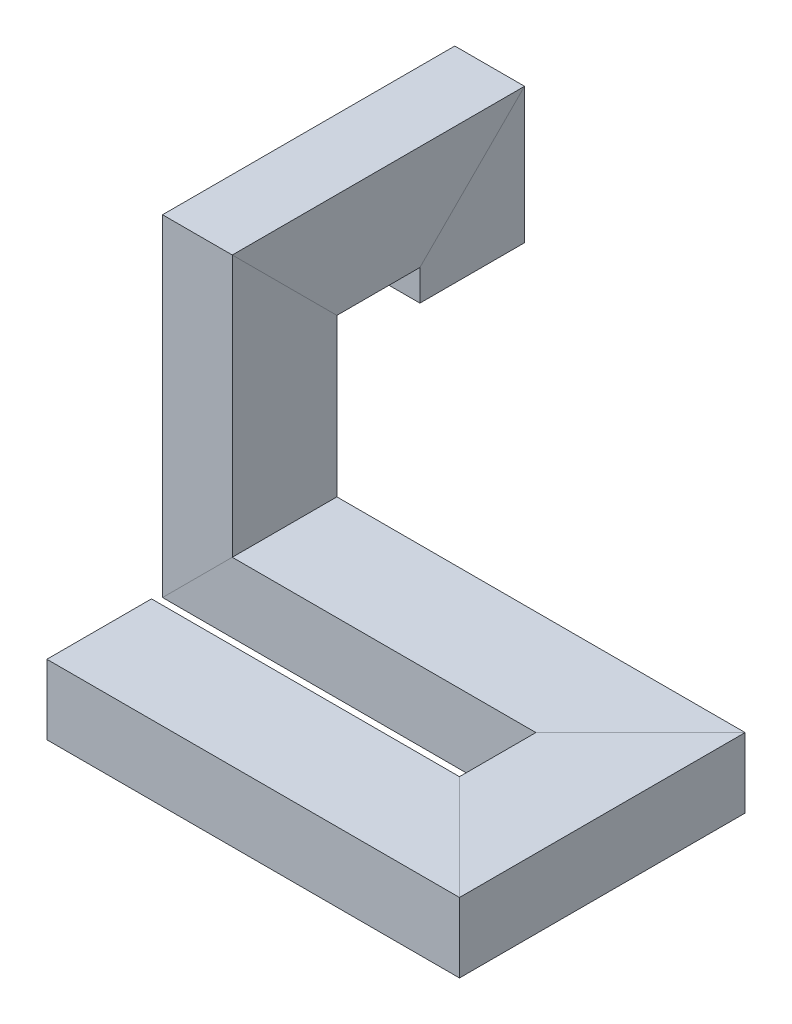
ISO-10303-21;
HEADER;
FILE_DESCRIPTION(('STEP AP214'),'2;1');
FILE_NAME('part.step','',(''),(''),'','','');
FILE_SCHEMA(('AUTOMOTIVE_DESIGN { 1 0 10303 214 1 1 1 1 }'));
ENDSEC;
DATA;
#1=APPLICATION_CONTEXT('core data for automotive mechanical design processes');
#2=APPLICATION_PROTOCOL_DEFINITION('international standard','automotive_design',2000,#1);
#3=PRODUCT_CONTEXT('',#1,'mechanical');
#4=PRODUCT('Part','Part','',(#3));
#5=PRODUCT_RELATED_PRODUCT_CATEGORY('part','',(#4));
#6=PRODUCT_DEFINITION_FORMATION('','',#4);
#7=PRODUCT_DEFINITION_CONTEXT('part definition',#1,'design');
#8=PRODUCT_DEFINITION('design','',#6,#7);
#9=PRODUCT_DEFINITION_SHAPE('','',#8);
#10=(LENGTH_UNIT() NAMED_UNIT(*) SI_UNIT(.MILLI.,.METRE.));
#11=(NAMED_UNIT(*) PLANE_ANGLE_UNIT() SI_UNIT($,.RADIAN.));
#12=(NAMED_UNIT(*) SI_UNIT($,.STERADIAN.) SOLID_ANGLE_UNIT());
#13=UNCERTAINTY_MEASURE_WITH_UNIT(LENGTH_MEASURE(1.E-05),#10,'distance_accuracy_value','');
#14=(GEOMETRIC_REPRESENTATION_CONTEXT(3) GLOBAL_UNCERTAINTY_ASSIGNED_CONTEXT((#13)) GLOBAL_UNIT_ASSIGNED_CONTEXT((#10,
#11,#12)) REPRESENTATION_CONTEXT('',''));
#15=CARTESIAN_POINT('',(0.,0.,0.));
#16=DIRECTION('',(0.,0.,1.));
#17=DIRECTION('',(1.,0.,0.));
#18=AXIS2_PLACEMENT_3D('',#15,#16,#17);
#19=CARTESIAN_POINT('',(-4.9966641084751,26.4053960343062,-60.4229539432097));
#20=DIRECTION('',(0.,1.,0.));
#21=DIRECTION('',(0.,0.,1.));
#22=AXIS2_PLACEMENT_3D('',#19,#20,#21);
#23=PLANE('',#22);
#24=DIRECTION('',(-1.,0.,0.));
#25=VECTOR('',#24,1.);
#26=CARTESIAN_POINT('',(0.7183358915249,26.4053960343062,-51.8504539432097));
#27=LINE('',#26,#25);
#28=CARTESIAN_POINT('',(0.718335891524899,26.4053960343062,-51.8504539432097));
#29=VERTEX_POINT('',#28);
#30=CARTESIAN_POINT('',(-10.7116641084751,26.4053960343062,-51.8504539432097));
#31=VERTEX_POINT('',#30);
#32=EDGE_CURVE('E126',#29,#31,#27,.T.);
#33=ORIENTED_EDGE('',*,*,#32,.T.);
#34=DIRECTION('',(0.,0.,-1.));
#35=VECTOR('',#34,1.);
#36=CARTESIAN_POINT('',(-10.7116641084751,26.4053960343062,-68.9954539432097));
#37=LINE('',#36,#35);
#38=CARTESIAN_POINT('',(-10.7116641084751,26.4053960343062,-68.9954539432097));
#39=VERTEX_POINT('',#38);
#40=EDGE_CURVE('E147',#31,#39,#37,.T.);
#41=ORIENTED_EDGE('',*,*,#40,.T.);
#42=DIRECTION('',(1.,0.,0.));
#43=VECTOR('',#42,1.);
#44=CARTESIAN_POINT('',(0.718335891524902,26.4053960343062,-68.9954539432097));
#45=LINE('',#44,#43);
#46=CARTESIAN_POINT('',(0.718335891524902,26.4053960343062,-68.9954539432097));
#47=VERTEX_POINT('',#46);
#48=EDGE_CURVE('E131',#39,#47,#45,.T.);
#49=ORIENTED_EDGE('',*,*,#48,.T.);
#50=DIRECTION('',(0.,0.,1.));
#51=VECTOR('',#50,1.);
#52=CARTESIAN_POINT('',(0.718335891524902,26.4053960343062,-68.9954539432097));
#53=LINE('',#52,#51);
#54=EDGE_CURVE('E129',#47,#29,#53,.T.);
#55=ORIENTED_EDGE('',*,*,#54,.T.);
#56=EDGE_LOOP('',(#33,#41,#49,#55));
#57=FACE_BOUND('',#56,.T.);
#58=ADVANCED_FACE('F43',(#57),#23,.F.);
#59=CARTESIAN_POINT('',(0.,0.,0.));
#60=DIRECTION('',(-1.,0.,0.));
#61=DIRECTION('',(0.,0.,1.));
#62=AXIS2_PLACEMENT_3D('',#59,#60,#61);
#63=PLANE('',#62);
#64=DIRECTION('',(0.,-1.,0.));
#65=VECTOR('',#64,1.);
#66=CARTESIAN_POINT('',(0.,5.715,8.5725));
#67=LINE('',#66,#65);
#68=CARTESIAN_POINT('',(0.,5.715,8.5725));
#69=VERTEX_POINT('',#68);
#70=CARTESIAN_POINT('',(0.,-5.715,8.5725));
#71=VERTEX_POINT('',#70);
#72=EDGE_CURVE('E289',#69,#71,#67,.T.);
#73=ORIENTED_EDGE('',*,*,#72,.F.);
#74=DIRECTION('',(0.,0.,1.));
#75=VECTOR('',#74,1.);
#76=CARTESIAN_POINT('',(0.,5.715,-8.5725));
#77=LINE('',#76,#75);
#78=CARTESIAN_POINT('',(0.,5.715,-8.5725));
#79=VERTEX_POINT('',#78);
#80=EDGE_CURVE('E296',#79,#69,#77,.T.);
#81=ORIENTED_EDGE('',*,*,#80,.F.);
#82=DIRECTION('',(0.,1.,0.));
#83=VECTOR('',#82,1.);
#84=CARTESIAN_POINT('',(0.,5.715,-8.5725));
#85=LINE('',#84,#83);
#86=CARTESIAN_POINT('',(0.,-5.715,-8.5725));
#87=VERTEX_POINT('',#86);
#88=EDGE_CURVE('E301',#87,#79,#85,.T.);
#89=ORIENTED_EDGE('',*,*,#88,.F.);
#90=DIRECTION('',(0.,0.,-1.));
#91=VECTOR('',#90,1.);
#92=CARTESIAN_POINT('',(0.,-5.715,-8.5725));
#93=LINE('',#92,#91);
#94=EDGE_CURVE('E309',#71,#87,#93,.T.);
#95=ORIENTED_EDGE('',*,*,#94,.F.);
#96=EDGE_LOOP('',(#73,#81,#89,#95));
#97=FACE_BOUND('',#96,.T.);
#98=ADVANCED_FACE('F349',(#97),#63,.T.);
#99=CARTESIAN_POINT('',(0.718335891524898,49.5753674214838,-51.8504539432097));
#100=DIRECTION('',(0.,0.,1.));
#101=DIRECTION('',(1.,0.,0.));
#102=AXIS2_PLACEMENT_3D('',#99,#100,#101);
#103=PLANE('',#102);
#104=DIRECTION('',(1.,0.,0.));
#105=VECTOR('',#104,1.);
#106=CARTESIAN_POINT('',(0.718335891524905,31.4731174214838,-51.8504539432097));
#107=LINE('',#106,#105);
#108=CARTESIAN_POINT('',(-10.7116641084751,31.4731174214838,-51.8504539432097));
#109=VERTEX_POINT('',#108);
#110=CARTESIAN_POINT('',(0.718335891524899,31.4731174214838,-51.8504539432097));
#111=VERTEX_POINT('',#110);
#112=EDGE_CURVE('E170',#109,#111,#107,.T.);
#113=ORIENTED_EDGE('',*,*,#112,.F.);
#114=DIRECTION('',(0.,-1.,0.));
#115=VECTOR('',#114,1.);
#116=CARTESIAN_POINT('',(-10.7116641084751,49.5753674214838,-51.8504539432097));
#117=LINE('',#116,#115);
#118=EDGE_CURVE('E144',#109,#31,#117,.T.);
#119=ORIENTED_EDGE('',*,*,#118,.T.);
#120=ORIENTED_EDGE('',*,*,#32,.F.);
#121=DIRECTION('',(0.,-1.,0.));
#122=VECTOR('',#121,1.);
#123=CARTESIAN_POINT('',(0.718335891524898,49.5753674214838,-51.8504539432097));
#124=LINE('',#123,#122);
#125=EDGE_CURVE('E46',#111,#29,#124,.T.);
#126=ORIENTED_EDGE('',*,*,#125,.F.);
#127=EDGE_LOOP('',(#113,#119,#120,#126));
#128=FACE_BOUND('',#127,.T.);
#129=ADVANCED_FACE('F141',(#128),#103,.T.);
#130=CARTESIAN_POINT('',(-10.7116641084751,49.5753674214838,-68.9954539432097));
#131=DIRECTION('',(-1.,0.,0.));
#132=DIRECTION('',(0.,0.,1.));
#133=AXIS2_PLACEMENT_3D('',#130,#131,#132);
#134=PLANE('',#133);
#135=DIRECTION('',(0.,-0.707106781186548,0.707106781186547));
#136=VECTOR('',#135,1.);
#137=CARTESIAN_POINT('',(-10.7116641084751,24.1898948450045,-44.5672313667304));
#138=LINE('',#137,#136);
#139=CARTESIAN_POINT('',(-10.7116641084751,48.6181174214838,-68.9954539432097));
#140=VERTEX_POINT('',#139);
#141=EDGE_CURVE('E190',#140,#109,#138,.T.);
#142=ORIENTED_EDGE('',*,*,#141,.F.);
#143=DIRECTION('',(0.,-1.,0.));
#144=VECTOR('',#143,1.);
#145=CARTESIAN_POINT('',(-10.7116641084751,49.5753674214838,-68.9954539432097));
#146=LINE('',#145,#144);
#147=EDGE_CURVE('E159',#140,#39,#146,.T.);
#148=ORIENTED_EDGE('',*,*,#147,.T.);
#149=ORIENTED_EDGE('',*,*,#40,.F.);
#150=ORIENTED_EDGE('',*,*,#118,.F.);
#151=EDGE_LOOP('',(#142,#148,#149,#150));
#152=FACE_BOUND('',#151,.T.);
#153=ADVANCED_FACE('F406',(#152),#134,.T.);
#154=CARTESIAN_POINT('',(0.7183358915249,49.5753674214838,-68.9954539432097));
#155=DIRECTION('',(0.,0.,-1.));
#156=DIRECTION('',(-1.,0.,0.));
#157=AXIS2_PLACEMENT_3D('',#154,#155,#156);
#158=PLANE('',#157);
#159=DIRECTION('',(-1.,0.,0.));
#160=VECTOR('',#159,1.);
#161=CARTESIAN_POINT('',(0.71833589152491,48.6181174214838,-68.9954539432097));
#162=LINE('',#161,#160);
#163=CARTESIAN_POINT('',(0.718335891524901,48.6181174214838,-68.9954539432097));
#164=VERTEX_POINT('',#163);
#165=EDGE_CURVE('E186',#164,#140,#162,.T.);
#166=ORIENTED_EDGE('',*,*,#165,.F.);
#167=DIRECTION('',(0.,-1.,0.));
#168=VECTOR('',#167,1.);
#169=CARTESIAN_POINT('',(0.7183358915249,49.5753674214838,-68.9954539432097));
#170=LINE('',#169,#168);
#171=EDGE_CURVE('E146',#164,#47,#170,.T.);
#172=ORIENTED_EDGE('',*,*,#171,.T.);
#173=ORIENTED_EDGE('',*,*,#48,.F.);
#174=ORIENTED_EDGE('',*,*,#147,.F.);
#175=EDGE_LOOP('',(#166,#172,#173,#174));
#176=FACE_BOUND('',#175,.T.);
#177=ADVANCED_FACE('F409',(#176),#158,.T.);
#178=CARTESIAN_POINT('',(0.7183358915249,49.5753674214838,-68.9954539432097));
#179=DIRECTION('',(1.,0.,0.));
#180=DIRECTION('',(0.,0.,-1.));
#181=AXIS2_PLACEMENT_3D('',#178,#179,#180);
#182=PLANE('',#181);
#183=DIRECTION('',(0.,0.707106781186548,-0.707106781186547));
#184=VECTOR('',#183,1.);
#185=CARTESIAN_POINT('',(0.718335891524898,24.1898948450045,-44.5672313667304));
#186=LINE('',#185,#184);
#187=EDGE_CURVE('E151',#111,#164,#186,.T.);
#188=ORIENTED_EDGE('',*,*,#187,.F.);
#189=ORIENTED_EDGE('',*,*,#125,.T.);
#190=ORIENTED_EDGE('',*,*,#54,.F.);
#191=ORIENTED_EDGE('',*,*,#171,.F.);
#192=EDGE_LOOP('',(#188,#189,#190,#191));
#193=FACE_BOUND('',#192,.T.);
#194=ADVANCED_FACE('F149',(#193),#182,.T.);
#195=CARTESIAN_POINT('',(0.718335891524902,48.6181174214838,-20.1390087902511));
#196=DIRECTION('',(1.,0.,0.));
#197=DIRECTION('',(0.,1.,0.));
#198=AXIS2_PLACEMENT_3D('',#195,#196,#197);
#199=PLANE('',#198);
#200=DIRECTION('',(0.,0.,-1.));
#201=VECTOR('',#200,1.);
#202=CARTESIAN_POINT('',(0.7183358915249,31.4731174214838,-20.1390087902511));
#203=LINE('',#202,#201);
#204=CARTESIAN_POINT('',(0.718335891524899,31.4731174214838,-38.2412587902511));
#205=VERTEX_POINT('',#204);
#206=EDGE_CURVE('E173',#205,#111,#203,.T.);
#207=ORIENTED_EDGE('',*,*,#206,.T.);
#208=ORIENTED_EDGE('',*,*,#187,.T.);
#209=DIRECTION('',(0.,0.,-1.));
#210=VECTOR('',#209,1.);
#211=CARTESIAN_POINT('',(0.718335891524902,48.6181174214838,-20.1390087902511));
#212=LINE('',#211,#210);
#213=CARTESIAN_POINT('',(0.718335891524902,48.6181174214838,-21.0962587902511));
#214=VERTEX_POINT('',#213);
#215=EDGE_CURVE('E153',#214,#164,#212,.T.);
#216=ORIENTED_EDGE('',*,*,#215,.F.);
#217=DIRECTION('',(0.,0.707106781186547,0.707106781186548));
#218=VECTOR('',#217,1.);
#219=CARTESIAN_POINT('',(0.718335891524898,21.1158087107419,-48.598567500993));
#220=LINE('',#219,#218);
#221=EDGE_CURVE('E199',#205,#214,#220,.T.);
#222=ORIENTED_EDGE('',*,*,#221,.F.);
#223=EDGE_LOOP('',(#207,#208,#216,#222));
#224=FACE_BOUND('',#223,.T.);
#225=ADVANCED_FACE('F402',(#224),#199,.T.);
#226=CARTESIAN_POINT('',(0.718335891524902,48.6181174214838,-20.1390087902511));
#227=DIRECTION('',(0.,1.,0.));
#228=DIRECTION('',(0.,0.,1.));
#229=AXIS2_PLACEMENT_3D('',#226,#227,#228);
#230=PLANE('',#229);
#231=ORIENTED_EDGE('',*,*,#215,.T.);
#232=ORIENTED_EDGE('',*,*,#165,.T.);
#233=DIRECTION('',(0.,0.,-1.));
#234=VECTOR('',#233,1.);
#235=CARTESIAN_POINT('',(-10.7116641084751,48.6181174214838,-20.1390087902511));
#236=LINE('',#235,#234);
#237=CARTESIAN_POINT('',(-10.7116641084751,48.6181174214838,-21.0962587902511));
#238=VERTEX_POINT('',#237);
#239=EDGE_CURVE('E157',#238,#140,#236,.T.);
#240=ORIENTED_EDGE('',*,*,#239,.F.);
#241=DIRECTION('',(-1.,0.,0.));
#242=VECTOR('',#241,1.);
#243=CARTESIAN_POINT('',(0.718335891524909,48.6181174214838,-21.0962587902511));
#244=LINE('',#243,#242);
#245=EDGE_CURVE('E218',#214,#238,#244,.T.);
#246=ORIENTED_EDGE('',*,*,#245,.F.);
#247=EDGE_LOOP('',(#231,#232,#240,#246));
#248=FACE_BOUND('',#247,.T.);
#249=ADVANCED_FACE('F393',(#248),#230,.T.);
#250=CARTESIAN_POINT('',(-10.7116641084751,48.6181174214838,-20.1390087902511));
#251=DIRECTION('',(-1.,0.,0.));
#252=DIRECTION('',(0.,-1.,0.));
#253=AXIS2_PLACEMENT_3D('',#250,#251,#252);
#254=PLANE('',#253);
#255=ORIENTED_EDGE('',*,*,#239,.T.);
#256=ORIENTED_EDGE('',*,*,#141,.T.);
#257=DIRECTION('',(0.,0.,-1.));
#258=VECTOR('',#257,1.);
#259=CARTESIAN_POINT('',(-10.7116641084751,31.4731174214838,-20.1390087902511));
#260=LINE('',#259,#258);
#261=CARTESIAN_POINT('',(-10.7116641084751,31.4731174214838,-38.2412587902511));
#262=VERTEX_POINT('',#261);
#263=EDGE_CURVE('E177',#262,#109,#260,.T.);
#264=ORIENTED_EDGE('',*,*,#263,.F.);
#265=DIRECTION('',(0.,-0.707106781186547,-0.707106781186548));
#266=VECTOR('',#265,1.);
#267=CARTESIAN_POINT('',(-10.7116641084751,21.1158087107419,-48.598567500993));
#268=LINE('',#267,#266);
#269=EDGE_CURVE('E222',#238,#262,#268,.T.);
#270=ORIENTED_EDGE('',*,*,#269,.F.);
#271=EDGE_LOOP('',(#255,#256,#264,#270));
#272=FACE_BOUND('',#271,.T.);
#273=ADVANCED_FACE('F391',(#272),#254,.T.);
#274=CARTESIAN_POINT('',(0.7183358915249,31.4731174214838,-20.1390087902511));
#275=DIRECTION('',(0.,-1.,0.));
#276=DIRECTION('',(0.,0.,-1.));
#277=AXIS2_PLACEMENT_3D('',#274,#275,#276);
#278=PLANE('',#277);
#279=ORIENTED_EDGE('',*,*,#263,.T.);
#280=ORIENTED_EDGE('',*,*,#112,.T.);
#281=ORIENTED_EDGE('',*,*,#206,.F.);
#282=DIRECTION('',(1.,0.,0.));
#283=VECTOR('',#282,1.);
#284=CARTESIAN_POINT('',(0.718335891524904,31.4731174214838,-38.2412587902511));
#285=LINE('',#284,#283);
#286=EDGE_CURVE('E195',#262,#205,#285,.T.);
#287=ORIENTED_EDGE('',*,*,#286,.F.);
#288=EDGE_LOOP('',(#279,#280,#281,#287));
#289=FACE_BOUND('',#288,.T.);
#290=ADVANCED_FACE('F404',(#289),#278,.T.);
#291=CARTESIAN_POINT('',(0.718335891524902,-6.3865,-21.0962587902511));
#292=DIRECTION('',(1.,0.,0.));
#293=DIRECTION('',(0.,0.,-1.));
#294=AXIS2_PLACEMENT_3D('',#291,#292,#293);
#295=PLANE('',#294);
#296=DIRECTION('',(0.,1.,0.));
#297=VECTOR('',#296,1.);
#298=CARTESIAN_POINT('',(0.7183358915249,-6.3865,-38.2412587902511));
#299=LINE('',#298,#297);
#300=CARTESIAN_POINT('',(0.718335891524908,5.715,-38.2412587902511));
#301=VERTEX_POINT('',#300);
#302=EDGE_CURVE('E200',#301,#205,#299,.T.);
#303=ORIENTED_EDGE('',*,*,#302,.T.);
#304=ORIENTED_EDGE('',*,*,#221,.T.);
#305=DIRECTION('',(0.,1.,0.));
#306=VECTOR('',#305,1.);
#307=CARTESIAN_POINT('',(0.718335891524902,-6.3865,-21.0962587902511));
#308=LINE('',#307,#306);
#309=CARTESIAN_POINT('',(0.71833589152491,5.71500000000001,-21.0962587902511));
#310=VERTEX_POINT('',#309);
#311=EDGE_CURVE('E194',#310,#214,#308,.T.);
#312=ORIENTED_EDGE('',*,*,#311,.F.);
#313=DIRECTION('',(0.,0.,1.));
#314=VECTOR('',#313,1.);
#315=CARTESIAN_POINT('',(0.71833589152491,5.715,-21.0962587902511));
#316=LINE('',#315,#314);
#317=EDGE_CURVE('E231',#301,#310,#316,.T.);
#318=ORIENTED_EDGE('',*,*,#317,.F.);
#319=EDGE_LOOP('',(#303,#304,#312,#318));
#320=FACE_BOUND('',#319,.T.);
#321=ADVANCED_FACE('F399',(#320),#295,.T.);
#322=CARTESIAN_POINT('',(0.718335891524902,-6.3865,-21.0962587902511));
#323=DIRECTION('',(0.,0.,1.));
#324=DIRECTION('',(1.,0.,0.));
#325=AXIS2_PLACEMENT_3D('',#322,#323,#324);
#326=PLANE('',#325);
#327=ORIENTED_EDGE('',*,*,#311,.T.);
#328=ORIENTED_EDGE('',*,*,#245,.T.);
#329=DIRECTION('',(0.,1.,0.));
#330=VECTOR('',#329,1.);
#331=CARTESIAN_POINT('',(-10.7116641084751,-6.3865,-21.0962587902511));
#332=LINE('',#331,#330);
#333=CARTESIAN_POINT('',(-10.7116641084751,-5.715,-21.0962587902511));
#334=VERTEX_POINT('',#333);
#335=EDGE_CURVE('E208',#334,#238,#332,.T.);
#336=ORIENTED_EDGE('',*,*,#335,.F.);
#337=DIRECTION('',(-0.707106781186548,-0.707106781186548,0.));
#338=VECTOR('',#337,1.);
#339=CARTESIAN_POINT('',(34.6503365193729,39.647000627848,-21.0962587902511));
#340=LINE('',#339,#338);
#341=EDGE_CURVE('E250',#310,#334,#340,.T.);
#342=ORIENTED_EDGE('',*,*,#341,.F.);
#343=EDGE_LOOP('',(#327,#328,#336,#342));
#344=FACE_BOUND('',#343,.T.);
#345=ADVANCED_FACE('F396',(#344),#326,.T.);
#346=CARTESIAN_POINT('',(-10.7116641084751,-6.3865,-21.0962587902511));
#347=DIRECTION('',(-1.,0.,0.));
#348=DIRECTION('',(0.,0.,1.));
#349=AXIS2_PLACEMENT_3D('',#346,#347,#348);
#350=PLANE('',#349);
#351=ORIENTED_EDGE('',*,*,#335,.T.);
#352=ORIENTED_EDGE('',*,*,#269,.T.);
#353=DIRECTION('',(0.,1.,0.));
#354=VECTOR('',#353,1.);
#355=CARTESIAN_POINT('',(-10.7116641084751,-6.3865,-38.2412587902511));
#356=LINE('',#355,#354);
#357=CARTESIAN_POINT('',(-10.7116641084751,-5.715,-38.2412587902511));
#358=VERTEX_POINT('',#357);
#359=EDGE_CURVE('E204',#358,#262,#356,.T.);
#360=ORIENTED_EDGE('',*,*,#359,.F.);
#361=DIRECTION('',(0.,0.,-1.));
#362=VECTOR('',#361,1.);
#363=CARTESIAN_POINT('',(-10.7116641084751,-5.715,-21.0962587902511));
#364=LINE('',#363,#362);
#365=EDGE_CURVE('E254',#334,#358,#364,.T.);
#366=ORIENTED_EDGE('',*,*,#365,.F.);
#367=EDGE_LOOP('',(#351,#352,#360,#366));
#368=FACE_BOUND('',#367,.T.);
#369=ADVANCED_FACE('F386',(#368),#350,.T.);
#370=CARTESIAN_POINT('',(0.7183358915249,-6.3865,-38.2412587902511));
#371=DIRECTION('',(0.,0.,-1.));
#372=DIRECTION('',(-1.,0.,0.));
#373=AXIS2_PLACEMENT_3D('',#370,#371,#372);
#374=PLANE('',#373);
#375=ORIENTED_EDGE('',*,*,#359,.T.);
#376=ORIENTED_EDGE('',*,*,#286,.T.);
#377=ORIENTED_EDGE('',*,*,#302,.F.);
#378=DIRECTION('',(0.707106781186548,0.707106781186548,0.));
#379=VECTOR('',#378,1.);
#380=CARTESIAN_POINT('',(34.6503365193729,39.647000627848,-38.2412587902511));
#381=LINE('',#380,#379);
#382=EDGE_CURVE('E227',#358,#301,#381,.T.);
#383=ORIENTED_EDGE('',*,*,#382,.F.);
#384=EDGE_LOOP('',(#375,#376,#377,#383));
#385=FACE_BOUND('',#384,.T.);
#386=ADVANCED_FACE('F384',(#385),#374,.T.);
#387=CARTESIAN_POINT('',(68.582337147221,5.715,-21.0962587902511));
#388=DIRECTION('',(0.,1.,0.));
#389=DIRECTION('',(0.,0.,1.));
#390=AXIS2_PLACEMENT_3D('',#387,#388,#389);
#391=PLANE('',#390);
#392=DIRECTION('',(-1.,0.,0.));
#393=VECTOR('',#392,1.);
#394=CARTESIAN_POINT('',(68.582337147221,5.715,-38.2412587902511));
#395=LINE('',#394,#393);
#396=CARTESIAN_POINT('',(67.625087147221,5.715,-38.2412587902511));
#397=VERTEX_POINT('',#396);
#398=EDGE_CURVE('E232',#397,#301,#395,.T.);
#399=ORIENTED_EDGE('',*,*,#398,.T.);
#400=ORIENTED_EDGE('',*,*,#317,.T.);
#401=DIRECTION('',(-1.,0.,0.));
#402=VECTOR('',#401,1.);
#403=CARTESIAN_POINT('',(68.582337147221,5.715,-21.0962587902511));
#404=LINE('',#403,#402);
#405=CARTESIAN_POINT('',(50.4800871472209,5.715,-21.0962587902511));
#406=VERTEX_POINT('',#405);
#407=EDGE_CURVE('E226',#406,#310,#404,.T.);
#408=ORIENTED_EDGE('',*,*,#407,.F.);
#409=DIRECTION('',(-0.707106781186548,0.,0.707106781186548));
#410=VECTOR('',#409,1.);
#411=CARTESIAN_POINT('',(35.1670827520954,5.71500000000001,-5.78325439512555));
#412=LINE('',#411,#410);
#413=EDGE_CURVE('E263',#397,#406,#412,.T.);
#414=ORIENTED_EDGE('',*,*,#413,.F.);
#415=EDGE_LOOP('',(#399,#400,#408,#414));
#416=FACE_BOUND('',#415,.T.);
#417=ADVANCED_FACE('F378',(#416),#391,.T.);
#418=CARTESIAN_POINT('',(68.582337147221,5.715,-21.0962587902511));
#419=DIRECTION('',(0.,0.,1.));
#420=DIRECTION('',(0.,-1.,0.));
#421=AXIS2_PLACEMENT_3D('',#418,#419,#420);
#422=PLANE('',#421);
#423=ORIENTED_EDGE('',*,*,#407,.T.);
#424=ORIENTED_EDGE('',*,*,#341,.T.);
#425=DIRECTION('',(-1.,0.,0.));
#426=VECTOR('',#425,1.);
#427=CARTESIAN_POINT('',(68.582337147221,-5.715,-21.0962587902511));
#428=LINE('',#427,#426);
#429=CARTESIAN_POINT('',(50.4800871472209,-5.715,-21.0962587902511));
#430=VERTEX_POINT('',#429);
#431=EDGE_CURVE('E240',#430,#334,#428,.T.);
#432=ORIENTED_EDGE('',*,*,#431,.F.);
#433=DIRECTION('',(0.,-1.,0.));
#434=VECTOR('',#433,1.);
#435=CARTESIAN_POINT('',(50.4800871472209,5.715,-21.0962587902511));
#436=LINE('',#435,#434);
#437=EDGE_CURVE('E281',#406,#430,#436,.T.);
#438=ORIENTED_EDGE('',*,*,#437,.F.);
#439=EDGE_LOOP('',(#423,#424,#432,#438));
#440=FACE_BOUND('',#439,.T.);
#441=ADVANCED_FACE('F372',(#440),#422,.T.);
#442=CARTESIAN_POINT('',(68.582337147221,-5.715,-21.0962587902511));
#443=DIRECTION('',(0.,-1.,0.));
#444=DIRECTION('',(0.,0.,-1.));
#445=AXIS2_PLACEMENT_3D('',#442,#443,#444);
#446=PLANE('',#445);
#447=ORIENTED_EDGE('',*,*,#431,.T.);
#448=ORIENTED_EDGE('',*,*,#365,.T.);
#449=DIRECTION('',(-1.,0.,0.));
#450=VECTOR('',#449,1.);
#451=CARTESIAN_POINT('',(68.582337147221,-5.715,-38.2412587902511));
#452=LINE('',#451,#450);
#453=CARTESIAN_POINT('',(67.6250871472209,-5.715,-38.2412587902511));
#454=VERTEX_POINT('',#453);
#455=EDGE_CURVE('E236',#454,#358,#452,.T.);
#456=ORIENTED_EDGE('',*,*,#455,.F.);
#457=DIRECTION('',(0.707106781186548,0.,-0.707106781186548));
#458=VECTOR('',#457,1.);
#459=CARTESIAN_POINT('',(35.1670827520954,-5.715,-5.78325439512555));
#460=LINE('',#459,#458);
#461=EDGE_CURVE('E285',#430,#454,#460,.T.);
#462=ORIENTED_EDGE('',*,*,#461,.F.);
#463=EDGE_LOOP('',(#447,#448,#456,#462));
#464=FACE_BOUND('',#463,.T.);
#465=ADVANCED_FACE('F370',(#464),#446,.T.);
#466=CARTESIAN_POINT('',(68.582337147221,5.715,-38.2412587902511));
#467=DIRECTION('',(0.,0.,-1.));
#468=DIRECTION('',(0.,1.,0.));
#469=AXIS2_PLACEMENT_3D('',#466,#467,#468);
#470=PLANE('',#469);
#471=ORIENTED_EDGE('',*,*,#455,.T.);
#472=ORIENTED_EDGE('',*,*,#382,.T.);
#473=ORIENTED_EDGE('',*,*,#398,.F.);
#474=DIRECTION('',(0.,1.,0.));
#475=VECTOR('',#474,1.);
#476=CARTESIAN_POINT('',(67.625087147221,5.71499999999999,-38.2412587902511));
#477=LINE('',#476,#475);
#478=EDGE_CURVE('E259',#454,#397,#477,.T.);
#479=ORIENTED_EDGE('',*,*,#478,.F.);
#480=EDGE_LOOP('',(#471,#472,#473,#479));
#481=FACE_BOUND('',#480,.T.);
#482=ADVANCED_FACE('F380',(#481),#470,.T.);
#483=CARTESIAN_POINT('',(50.4800871472209,5.715,9.52975000000001));
#484=DIRECTION('',(0.,1.,0.));
#485=DIRECTION('',(-1.,0.,0.));
#486=AXIS2_PLACEMENT_3D('',#483,#484,#485);
#487=PLANE('',#486);
#488=DIRECTION('',(0.,0.,-1.));
#489=VECTOR('',#488,1.);
#490=CARTESIAN_POINT('',(67.625087147221,5.715,9.52975000000001));
#491=LINE('',#490,#489);
#492=CARTESIAN_POINT('',(67.625087147221,5.715,8.57250000000001));
#493=VERTEX_POINT('',#492);
#494=EDGE_CURVE('E264',#493,#397,#491,.T.);
#495=ORIENTED_EDGE('',*,*,#494,.T.);
#496=ORIENTED_EDGE('',*,*,#413,.T.);
#497=DIRECTION('',(0.,0.,-1.));
#498=VECTOR('',#497,1.);
#499=CARTESIAN_POINT('',(50.4800871472209,5.715,9.52975000000001));
#500=LINE('',#499,#498);
#501=CARTESIAN_POINT('',(50.4800871472209,5.715,-8.5725));
#502=VERTEX_POINT('',#501);
#503=EDGE_CURVE('E258',#502,#406,#500,.T.);
#504=ORIENTED_EDGE('',*,*,#503,.F.);
#505=DIRECTION('',(-0.707106781186548,0.,-0.707106781186548));
#506=VECTOR('',#505,1.);
#507=CARTESIAN_POINT('',(25.2400435736105,5.71500000000001,-33.8125435736105));
#508=LINE('',#507,#506);
#509=EDGE_CURVE('E294',#493,#502,#508,.T.);
#510=ORIENTED_EDGE('',*,*,#509,.F.);
#511=EDGE_LOOP('',(#495,#496,#504,#510));
#512=FACE_BOUND('',#511,.T.);
#513=ADVANCED_FACE('F375',(#512),#487,.T.);
#514=CARTESIAN_POINT('',(50.4800871472209,5.715,9.52975000000001));
#515=DIRECTION('',(-1.,0.,0.));
#516=DIRECTION('',(0.,-1.,0.));
#517=AXIS2_PLACEMENT_3D('',#514,#515,#516);
#518=PLANE('',#517);
#519=ORIENTED_EDGE('',*,*,#503,.T.);
#520=ORIENTED_EDGE('',*,*,#437,.T.);
#521=DIRECTION('',(0.,0.,-1.));
#522=VECTOR('',#521,1.);
#523=CARTESIAN_POINT('',(50.4800871472209,-5.715,9.52975000000001));
#524=LINE('',#523,#522);
#525=CARTESIAN_POINT('',(50.4800871472209,-5.715,-8.5725));
#526=VERTEX_POINT('',#525);
#527=EDGE_CURVE('E272',#526,#430,#524,.T.);
#528=ORIENTED_EDGE('',*,*,#527,.F.);
#529=DIRECTION('',(0.,-1.,0.));
#530=VECTOR('',#529,1.);
#531=CARTESIAN_POINT('',(50.480087147221,5.715,-8.5725));
#532=LINE('',#531,#530);
#533=EDGE_CURVE('E53',#502,#526,#532,.T.);
#534=ORIENTED_EDGE('',*,*,#533,.F.);
#535=EDGE_LOOP('',(#519,#520,#528,#534));
#536=FACE_BOUND('',#535,.T.);
#537=ADVANCED_FACE('F374',(#536),#518,.T.);
#538=CARTESIAN_POINT('',(50.4800871472209,-5.715,9.52975000000001));
#539=DIRECTION('',(0.,-1.,0.));
#540=DIRECTION('',(1.,0.,0.));
#541=AXIS2_PLACEMENT_3D('',#538,#539,#540);
#542=PLANE('',#541);
#543=ORIENTED_EDGE('',*,*,#527,.T.);
#544=ORIENTED_EDGE('',*,*,#461,.T.);
#545=DIRECTION('',(0.,0.,-1.));
#546=VECTOR('',#545,1.);
#547=CARTESIAN_POINT('',(67.6250871472209,-5.715,9.52975000000001));
#548=LINE('',#547,#546);
#549=CARTESIAN_POINT('',(67.625087147221,-5.715,8.57250000000001));
#550=VERTEX_POINT('',#549);
#551=EDGE_CURVE('E268',#550,#454,#548,.T.);
#552=ORIENTED_EDGE('',*,*,#551,.F.);
#553=DIRECTION('',(0.707106781186548,0.,0.707106781186548));
#554=VECTOR('',#553,1.);
#555=CARTESIAN_POINT('',(25.2400435736105,-5.71499999999999,-33.8125435736105));
#556=LINE('',#555,#554);
#557=EDGE_CURVE('E11',#526,#550,#556,.T.);
#558=ORIENTED_EDGE('',*,*,#557,.F.);
#559=EDGE_LOOP('',(#543,#544,#552,#558));
#560=FACE_BOUND('',#559,.T.);
#561=ADVANCED_FACE('F366',(#560),#542,.T.);
#562=CARTESIAN_POINT('',(67.625087147221,5.715,9.52975000000001));
#563=DIRECTION('',(1.,0.,0.));
#564=DIRECTION('',(0.,1.,0.));
#565=AXIS2_PLACEMENT_3D('',#562,#563,#564);
#566=PLANE('',#565);
#567=ORIENTED_EDGE('',*,*,#551,.T.);
#568=ORIENTED_EDGE('',*,*,#478,.T.);
#569=ORIENTED_EDGE('',*,*,#494,.F.);
#570=DIRECTION('',(0.,1.,0.));
#571=VECTOR('',#570,1.);
#572=CARTESIAN_POINT('',(67.625087147221,5.71499999999999,8.5725));
#573=LINE('',#572,#571);
#574=EDGE_CURVE('E290',#550,#493,#573,.T.);
#575=ORIENTED_EDGE('',*,*,#574,.F.);
#576=EDGE_LOOP('',(#567,#568,#569,#575));
#577=FACE_BOUND('',#576,.T.);
#578=ADVANCED_FACE('F365',(#577),#566,.T.);
#579=CARTESIAN_POINT('',(0.,5.715,-8.5725));
#580=DIRECTION('',(0.,1.,0.));
#581=DIRECTION('',(0.,0.,1.));
#582=AXIS2_PLACEMENT_3D('',#579,#580,#581);
#583=PLANE('',#582);
#584=DIRECTION('',(1.,0.,0.));
#585=VECTOR('',#584,1.);
#586=CARTESIAN_POINT('',(0.,5.715,8.5725));
#587=LINE('',#586,#585);
#588=EDGE_CURVE('E300',#69,#493,#587,.T.);
#589=ORIENTED_EDGE('',*,*,#588,.T.);
#590=ORIENTED_EDGE('',*,*,#509,.T.);
#591=DIRECTION('',(1.,0.,0.));
#592=VECTOR('',#591,1.);
#593=CARTESIAN_POINT('',(0.,5.715,-8.5725));
#594=LINE('',#593,#592);
#595=EDGE_CURVE('E295',#79,#502,#594,.T.);
#596=ORIENTED_EDGE('',*,*,#595,.F.);
#597=ORIENTED_EDGE('',*,*,#80,.T.);
#598=EDGE_LOOP('',(#589,#590,#596,#597));
#599=FACE_BOUND('',#598,.T.);
#600=ADVANCED_FACE('F358',(#599),#583,.T.);
#601=CARTESIAN_POINT('',(0.,5.715,-8.5725));
#602=DIRECTION('',(0.,0.,-1.));
#603=DIRECTION('',(0.,1.,0.));
#604=AXIS2_PLACEMENT_3D('',#601,#602,#603);
#605=PLANE('',#604);
#606=ORIENTED_EDGE('',*,*,#595,.T.);
#607=ORIENTED_EDGE('',*,*,#533,.T.);
#608=DIRECTION('',(1.,0.,0.));
#609=VECTOR('',#608,1.);
#610=CARTESIAN_POINT('',(0.,-5.715,-8.5725));
#611=LINE('',#610,#609);
#612=EDGE_CURVE('E305',#87,#526,#611,.T.);
#613=ORIENTED_EDGE('',*,*,#612,.F.);
#614=ORIENTED_EDGE('',*,*,#88,.T.);
#615=EDGE_LOOP('',(#606,#607,#613,#614));
#616=FACE_BOUND('',#615,.T.);
#617=ADVANCED_FACE('F333',(#616),#605,.T.);
#618=CARTESIAN_POINT('',(0.,-5.715,-8.5725));
#619=DIRECTION('',(0.,-1.,0.));
#620=DIRECTION('',(0.,0.,-1.));
#621=AXIS2_PLACEMENT_3D('',#618,#619,#620);
#622=PLANE('',#621);
#623=ORIENTED_EDGE('',*,*,#612,.T.);
#624=ORIENTED_EDGE('',*,*,#557,.T.);
#625=DIRECTION('',(1.,0.,0.));
#626=VECTOR('',#625,1.);
#627=CARTESIAN_POINT('',(0.,-5.715,8.5725));
#628=LINE('',#627,#626);
#629=EDGE_CURVE('E313',#71,#550,#628,.T.);
#630=ORIENTED_EDGE('',*,*,#629,.F.);
#631=ORIENTED_EDGE('',*,*,#94,.T.);
#632=EDGE_LOOP('',(#623,#624,#630,#631));
#633=FACE_BOUND('',#632,.T.);
#634=ADVANCED_FACE('F339',(#633),#622,.T.);
#635=CARTESIAN_POINT('',(0.,5.715,8.5725));
#636=DIRECTION('',(0.,0.,1.));
#637=DIRECTION('',(0.,-1.,0.));
#638=AXIS2_PLACEMENT_3D('',#635,#636,#637);
#639=PLANE('',#638);
#640=ORIENTED_EDGE('',*,*,#629,.T.);
#641=ORIENTED_EDGE('',*,*,#574,.T.);
#642=ORIENTED_EDGE('',*,*,#588,.F.);
#643=ORIENTED_EDGE('',*,*,#72,.T.);
#644=EDGE_LOOP('',(#640,#641,#642,#643));
#645=FACE_BOUND('',#644,.T.);
#646=ADVANCED_FACE('F354',(#645),#639,.T.);
#647=CLOSED_SHELL('',(#58,#98,#129,#153,#177,#194,#225,#249,#273,#290,#321,#345,#369,#386,#417,
#441,#465,#482,#513,#537,#561,#578,#600,#617,#634,#646));
#648=MANIFOLD_SOLID_BREP('B2',#647);
#649=ADVANCED_BREP_SHAPE_REPRESENTATION('',(#18,#648),#14);
#650=SHAPE_DEFINITION_REPRESENTATION(#9,#649);
ENDSEC;
END-ISO-10303-21;
